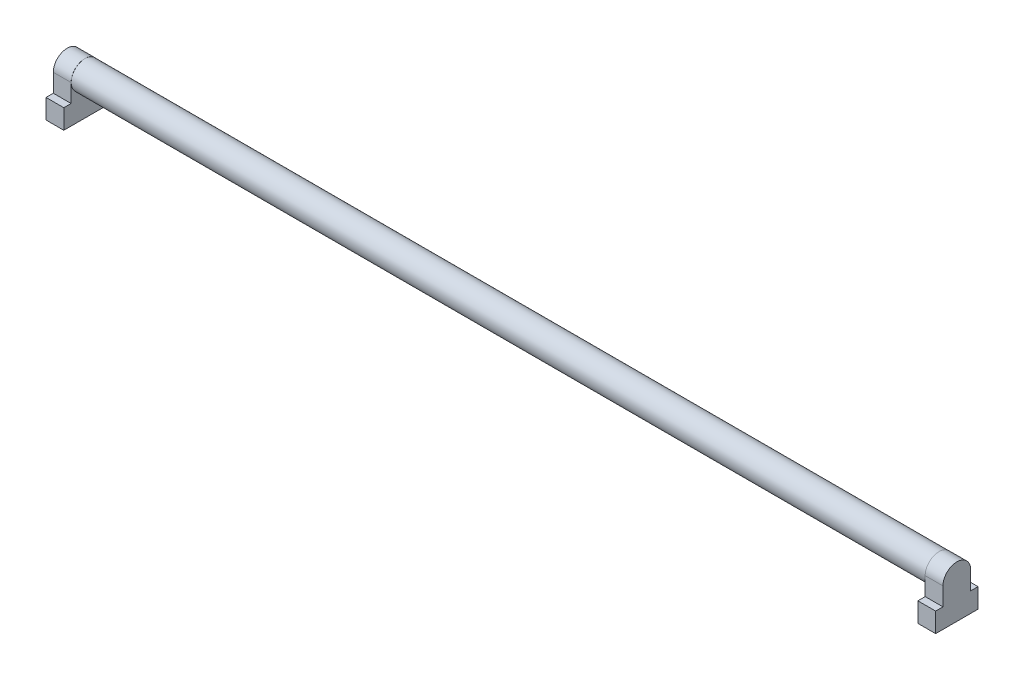
ISO-10303-21;
HEADER;
FILE_DESCRIPTION(('STEP AP214'),'2;1');
FILE_NAME('part.step','',(''),(''),'','','');
FILE_SCHEMA(('AUTOMOTIVE_DESIGN { 1 0 10303 214 1 1 1 1 }'));
ENDSEC;
DATA;
#1=APPLICATION_CONTEXT('core data for automotive mechanical design processes');
#2=APPLICATION_PROTOCOL_DEFINITION('international standard','automotive_design',2000,#1);
#3=PRODUCT_CONTEXT('',#1,'mechanical');
#4=PRODUCT('Part','Part','',(#3));
#5=PRODUCT_RELATED_PRODUCT_CATEGORY('part','',(#4));
#6=PRODUCT_DEFINITION_FORMATION('','',#4);
#7=PRODUCT_DEFINITION_CONTEXT('part definition',#1,'design');
#8=PRODUCT_DEFINITION('design','',#6,#7);
#9=PRODUCT_DEFINITION_SHAPE('','',#8);
#10=(LENGTH_UNIT() NAMED_UNIT(*) SI_UNIT(.MILLI.,.METRE.));
#11=(NAMED_UNIT(*) PLANE_ANGLE_UNIT() SI_UNIT($,.RADIAN.));
#12=(NAMED_UNIT(*) SI_UNIT($,.STERADIAN.) SOLID_ANGLE_UNIT());
#13=UNCERTAINTY_MEASURE_WITH_UNIT(LENGTH_MEASURE(1.E-05),#10,'distance_accuracy_value','');
#14=(GEOMETRIC_REPRESENTATION_CONTEXT(3) GLOBAL_UNCERTAINTY_ASSIGNED_CONTEXT((#13)) GLOBAL_UNIT_ASSIGNED_CONTEXT((#10,
#11,#12)) REPRESENTATION_CONTEXT('',''));
#15=CARTESIAN_POINT('',(0.,0.,0.));
#16=DIRECTION('',(0.,0.,1.));
#17=DIRECTION('',(1.,0.,0.));
#18=AXIS2_PLACEMENT_3D('',#15,#16,#17);
#19=CARTESIAN_POINT('',(240.,0.,0.));
#20=DIRECTION('',(-1.,0.,0.));
#21=DIRECTION('',(0.,0.,1.));
#22=AXIS2_PLACEMENT_3D('',#19,#20,#21);
#23=CYLINDRICAL_SURFACE('',#22,7.75);
#24=CARTESIAN_POINT('',(240.,0.,0.));
#25=DIRECTION('',(1.,0.,0.));
#26=DIRECTION('',(0.,0.,-1.));
#27=AXIS2_PLACEMENT_3D('',#24,#25,#26);
#28=CIRCLE('',#27,7.75);
#29=CARTESIAN_POINT('',(240.,0.,-7.75));
#30=VERTEX_POINT('',#29);
#31=EDGE_CURVE('E11',#30,#30,#28,.T.);
#32=ORIENTED_EDGE('',*,*,#31,.F.);
#33=EDGE_LOOP('',(#32));
#34=FACE_BOUND('',#33,.T.);
#35=CARTESIAN_POINT('',(-240.,0.,0.));
#36=DIRECTION('',(1.,0.,0.));
#37=DIRECTION('',(0.,0.,-1.));
#38=AXIS2_PLACEMENT_3D('',#35,#36,#37);
#39=CIRCLE('',#38,7.75);
#40=CARTESIAN_POINT('',(-240.,0.,-7.75));
#41=VERTEX_POINT('',#40);
#42=EDGE_CURVE('E140',#41,#41,#39,.T.);
#43=ORIENTED_EDGE('',*,*,#42,.T.);
#44=EDGE_LOOP('',(#43));
#45=FACE_BOUND('',#44,.T.);
#46=ADVANCED_FACE('F35',(#34,#45),#23,.T.);
#47=CARTESIAN_POINT('',(250.,0.,0.));
#48=DIRECTION('',(-1.,0.,0.));
#49=DIRECTION('',(0.,0.,1.));
#50=AXIS2_PLACEMENT_3D('',#47,#48,#49);
#51=CYLINDRICAL_SURFACE('',#50,7.8);
#52=CARTESIAN_POINT('',(240.,0.,0.));
#53=DIRECTION('',(1.,0.,0.));
#54=DIRECTION('',(0.,0.,1.));
#55=AXIS2_PLACEMENT_3D('',#52,#53,#54);
#56=CIRCLE('',#55,7.8);
#57=CARTESIAN_POINT('',(240.,0.,-7.8));
#58=VERTEX_POINT('',#57);
#59=CARTESIAN_POINT('',(240.,0.,7.8));
#60=VERTEX_POINT('',#59);
#61=EDGE_CURVE('E136',#58,#60,#56,.T.);
#62=ORIENTED_EDGE('',*,*,#61,.T.);
#63=DIRECTION('',(-1.,0.,0.));
#64=VECTOR('',#63,1.);
#65=CARTESIAN_POINT('',(250.,0.,7.8));
#66=LINE('',#65,#64);
#67=CARTESIAN_POINT('',(250.,0.,7.8));
#68=VERTEX_POINT('',#67);
#69=EDGE_CURVE('E43',#68,#60,#66,.T.);
#70=ORIENTED_EDGE('',*,*,#69,.F.);
#71=CARTESIAN_POINT('',(250.,0.,0.));
#72=DIRECTION('',(1.,0.,0.));
#73=DIRECTION('',(0.,0.,1.));
#74=AXIS2_PLACEMENT_3D('',#71,#72,#73);
#75=CIRCLE('',#74,7.8);
#76=CARTESIAN_POINT('',(250.,0.,-7.8));
#77=VERTEX_POINT('',#76);
#78=EDGE_CURVE('E151',#77,#68,#75,.T.);
#79=ORIENTED_EDGE('',*,*,#78,.F.);
#80=DIRECTION('',(-1.,0.,0.));
#81=VECTOR('',#80,1.);
#82=CARTESIAN_POINT('',(250.,0.,-7.8));
#83=LINE('',#82,#81);
#84=EDGE_CURVE('E132',#77,#58,#83,.T.);
#85=ORIENTED_EDGE('',*,*,#84,.T.);
#86=EDGE_LOOP('',(#62,#70,#79,#85));
#87=FACE_BOUND('',#86,.T.);
#88=ADVANCED_FACE('F168',(#87),#51,.T.);
#89=CARTESIAN_POINT('',(250.,0.,7.8));
#90=DIRECTION('',(0.,0.,-1.));
#91=DIRECTION('',(0.,1.,0.));
#92=AXIS2_PLACEMENT_3D('',#89,#90,#91);
#93=PLANE('',#92);
#94=DIRECTION('',(0.,-1.,0.));
#95=VECTOR('',#94,1.);
#96=CARTESIAN_POINT('',(240.,0.,7.8));
#97=LINE('',#96,#95);
#98=CARTESIAN_POINT('',(240.,-10.2,7.8));
#99=VERTEX_POINT('',#98);
#100=EDGE_CURVE('E139',#60,#99,#97,.T.);
#101=ORIENTED_EDGE('',*,*,#100,.T.);
#102=DIRECTION('',(-1.,0.,0.));
#103=VECTOR('',#102,1.);
#104=CARTESIAN_POINT('',(250.,-10.2,7.8));
#105=LINE('',#104,#103);
#106=CARTESIAN_POINT('',(250.,-10.2,7.8));
#107=VERTEX_POINT('',#106);
#108=EDGE_CURVE('E161',#107,#99,#105,.T.);
#109=ORIENTED_EDGE('',*,*,#108,.F.);
#110=DIRECTION('',(0.,-1.,0.));
#111=VECTOR('',#110,1.);
#112=CARTESIAN_POINT('',(250.,0.,7.8));
#113=LINE('',#112,#111);
#114=EDGE_CURVE('E96',#68,#107,#113,.T.);
#115=ORIENTED_EDGE('',*,*,#114,.F.);
#116=ORIENTED_EDGE('',*,*,#69,.T.);
#117=EDGE_LOOP('',(#101,#109,#115,#116));
#118=FACE_BOUND('',#117,.T.);
#119=ADVANCED_FACE('F164',(#118),#93,.F.);
#120=CARTESIAN_POINT('',(250.,-10.2,7.8));
#121=DIRECTION('',(0.,-1.,0.));
#122=DIRECTION('',(0.,0.,-1.));
#123=AXIS2_PLACEMENT_3D('',#120,#121,#122);
#124=PLANE('',#123);
#125=DIRECTION('',(0.,0.,1.));
#126=VECTOR('',#125,1.);
#127=CARTESIAN_POINT('',(240.,-10.2,7.8));
#128=LINE('',#127,#126);
#129=CARTESIAN_POINT('',(240.,-10.2,11.9));
#130=VERTEX_POINT('',#129);
#131=EDGE_CURVE('E142',#99,#130,#128,.T.);
#132=ORIENTED_EDGE('',*,*,#131,.T.);
#133=DIRECTION('',(-1.,0.,0.));
#134=VECTOR('',#133,1.);
#135=CARTESIAN_POINT('',(250.,-10.2,11.9));
#136=LINE('',#135,#134);
#137=CARTESIAN_POINT('',(250.,-10.2,11.9));
#138=VERTEX_POINT('',#137);
#139=EDGE_CURVE('E158',#138,#130,#136,.T.);
#140=ORIENTED_EDGE('',*,*,#139,.F.);
#141=DIRECTION('',(0.,0.,1.));
#142=VECTOR('',#141,1.);
#143=CARTESIAN_POINT('',(250.,-10.2,7.8));
#144=LINE('',#143,#142);
#145=EDGE_CURVE('E183',#107,#138,#144,.T.);
#146=ORIENTED_EDGE('',*,*,#145,.F.);
#147=ORIENTED_EDGE('',*,*,#108,.T.);
#148=EDGE_LOOP('',(#132,#140,#146,#147));
#149=FACE_BOUND('',#148,.T.);
#150=ADVANCED_FACE('F176',(#149),#124,.F.);
#151=CARTESIAN_POINT('',(250.,-10.2,11.9));
#152=DIRECTION('',(0.,0.,-1.));
#153=DIRECTION('',(0.,1.,0.));
#154=AXIS2_PLACEMENT_3D('',#151,#152,#153);
#155=PLANE('',#154);
#156=DIRECTION('',(0.,-1.,0.));
#157=VECTOR('',#156,1.);
#158=CARTESIAN_POINT('',(240.,-10.2,11.9));
#159=LINE('',#158,#157);
#160=CARTESIAN_POINT('',(240.,-21.2,11.9));
#161=VERTEX_POINT('',#160);
#162=EDGE_CURVE('E144',#130,#161,#159,.T.);
#163=ORIENTED_EDGE('',*,*,#162,.T.);
#164=DIRECTION('',(-1.,0.,0.));
#165=VECTOR('',#164,1.);
#166=CARTESIAN_POINT('',(250.,-21.2,11.9));
#167=LINE('',#166,#165);
#168=CARTESIAN_POINT('',(250.,-21.2,11.9));
#169=VERTEX_POINT('',#168);
#170=EDGE_CURVE('E155',#169,#161,#167,.T.);
#171=ORIENTED_EDGE('',*,*,#170,.F.);
#172=DIRECTION('',(0.,-1.,0.));
#173=VECTOR('',#172,1.);
#174=CARTESIAN_POINT('',(250.,-10.2,11.9));
#175=LINE('',#174,#173);
#176=EDGE_CURVE('E182',#138,#169,#175,.T.);
#177=ORIENTED_EDGE('',*,*,#176,.F.);
#178=ORIENTED_EDGE('',*,*,#139,.T.);
#179=EDGE_LOOP('',(#163,#171,#177,#178));
#180=FACE_BOUND('',#179,.T.);
#181=ADVANCED_FACE('F180',(#180),#155,.F.);
#182=CARTESIAN_POINT('',(250.,-21.2,11.9));
#183=DIRECTION('',(0.,1.,0.));
#184=DIRECTION('',(0.,0.,1.));
#185=AXIS2_PLACEMENT_3D('',#182,#183,#184);
#186=PLANE('',#185);
#187=DIRECTION('',(0.,0.,-1.));
#188=VECTOR('',#187,1.);
#189=CARTESIAN_POINT('',(240.,-21.2,11.9));
#190=LINE('',#189,#188);
#191=CARTESIAN_POINT('',(240.,-21.2,-11.9));
#192=VERTEX_POINT('',#191);
#193=EDGE_CURVE('E146',#161,#192,#190,.T.);
#194=ORIENTED_EDGE('',*,*,#193,.T.);
#195=DIRECTION('',(-1.,0.,0.));
#196=VECTOR('',#195,1.);
#197=CARTESIAN_POINT('',(250.,-21.2,-11.9));
#198=LINE('',#197,#196);
#199=CARTESIAN_POINT('',(250.,-21.2,-11.9));
#200=VERTEX_POINT('',#199);
#201=EDGE_CURVE('E127',#200,#192,#198,.T.);
#202=ORIENTED_EDGE('',*,*,#201,.F.);
#203=DIRECTION('',(0.,0.,-1.));
#204=VECTOR('',#203,1.);
#205=CARTESIAN_POINT('',(250.,-21.2,11.9));
#206=LINE('',#205,#204);
#207=EDGE_CURVE('E118',#169,#200,#206,.T.);
#208=ORIENTED_EDGE('',*,*,#207,.F.);
#209=ORIENTED_EDGE('',*,*,#170,.T.);
#210=EDGE_LOOP('',(#194,#202,#208,#209));
#211=FACE_BOUND('',#210,.T.);
#212=ADVANCED_FACE('F465',(#211),#186,.F.);
#213=CARTESIAN_POINT('',(250.,-21.2,-11.9));
#214=DIRECTION('',(0.,0.,1.));
#215=DIRECTION('',(1.,0.,0.));
#216=AXIS2_PLACEMENT_3D('',#213,#214,#215);
#217=PLANE('',#216);
#218=DIRECTION('',(0.,1.,0.));
#219=VECTOR('',#218,1.);
#220=CARTESIAN_POINT('',(240.,-21.2,-11.9));
#221=LINE('',#220,#219);
#222=CARTESIAN_POINT('',(240.,-10.2,-11.9));
#223=VERTEX_POINT('',#222);
#224=EDGE_CURVE('E126',#192,#223,#221,.T.);
#225=ORIENTED_EDGE('',*,*,#224,.T.);
#226=DIRECTION('',(-1.,0.,0.));
#227=VECTOR('',#226,1.);
#228=CARTESIAN_POINT('',(250.,-10.2,-11.9));
#229=LINE('',#228,#227);
#230=CARTESIAN_POINT('',(250.,-10.2,-11.9));
#231=VERTEX_POINT('',#230);
#232=EDGE_CURVE('E123',#231,#223,#229,.T.);
#233=ORIENTED_EDGE('',*,*,#232,.F.);
#234=DIRECTION('',(0.,1.,0.));
#235=VECTOR('',#234,1.);
#236=CARTESIAN_POINT('',(250.,-21.2,-11.9));
#237=LINE('',#236,#235);
#238=EDGE_CURVE('E112',#200,#231,#237,.T.);
#239=ORIENTED_EDGE('',*,*,#238,.F.);
#240=ORIENTED_EDGE('',*,*,#201,.T.);
#241=EDGE_LOOP('',(#225,#233,#239,#240));
#242=FACE_BOUND('',#241,.T.);
#243=ADVANCED_FACE('F124',(#242),#217,.F.);
#244=CARTESIAN_POINT('',(250.,-10.2,-11.9));
#245=DIRECTION('',(0.,-1.,0.));
#246=DIRECTION('',(0.,0.,-1.));
#247=AXIS2_PLACEMENT_3D('',#244,#245,#246);
#248=PLANE('',#247);
#249=DIRECTION('',(0.,0.,1.));
#250=VECTOR('',#249,1.);
#251=CARTESIAN_POINT('',(240.,-10.2,-11.9));
#252=LINE('',#251,#250);
#253=CARTESIAN_POINT('',(240.,-10.2,-7.8));
#254=VERTEX_POINT('',#253);
#255=EDGE_CURVE('E81',#223,#254,#252,.T.);
#256=ORIENTED_EDGE('',*,*,#255,.T.);
#257=DIRECTION('',(-1.,0.,0.));
#258=VECTOR('',#257,1.);
#259=CARTESIAN_POINT('',(250.,-10.2,-7.8));
#260=LINE('',#259,#258);
#261=CARTESIAN_POINT('',(250.,-10.2,-7.8));
#262=VERTEX_POINT('',#261);
#263=EDGE_CURVE('E128',#262,#254,#260,.T.);
#264=ORIENTED_EDGE('',*,*,#263,.F.);
#265=DIRECTION('',(0.,0.,1.));
#266=VECTOR('',#265,1.);
#267=CARTESIAN_POINT('',(250.,-10.2,-11.9));
#268=LINE('',#267,#266);
#269=EDGE_CURVE('E116',#231,#262,#268,.T.);
#270=ORIENTED_EDGE('',*,*,#269,.F.);
#271=ORIENTED_EDGE('',*,*,#232,.T.);
#272=EDGE_LOOP('',(#256,#264,#270,#271));
#273=FACE_BOUND('',#272,.T.);
#274=ADVANCED_FACE('F130',(#273),#248,.F.);
#275=CARTESIAN_POINT('',(250.,-10.2,-7.8));
#276=DIRECTION('',(0.,0.,1.));
#277=DIRECTION('',(0.,-1.,0.));
#278=AXIS2_PLACEMENT_3D('',#275,#276,#277);
#279=PLANE('',#278);
#280=DIRECTION('',(0.,1.,0.));
#281=VECTOR('',#280,1.);
#282=CARTESIAN_POINT('',(240.,-10.2,-7.8));
#283=LINE('',#282,#281);
#284=EDGE_CURVE('E87',#254,#58,#283,.T.);
#285=ORIENTED_EDGE('',*,*,#284,.T.);
#286=ORIENTED_EDGE('',*,*,#84,.F.);
#287=DIRECTION('',(0.,1.,0.));
#288=VECTOR('',#287,1.);
#289=CARTESIAN_POINT('',(250.,-10.2,-7.8));
#290=LINE('',#289,#288);
#291=EDGE_CURVE('E51',#262,#77,#290,.T.);
#292=ORIENTED_EDGE('',*,*,#291,.F.);
#293=ORIENTED_EDGE('',*,*,#263,.T.);
#294=EDGE_LOOP('',(#285,#286,#292,#293));
#295=FACE_BOUND('',#294,.T.);
#296=ADVANCED_FACE('F443',(#295),#279,.F.);
#297=CARTESIAN_POINT('',(250.,0.,0.));
#298=DIRECTION('',(-1.,0.,0.));
#299=DIRECTION('',(0.,0.,1.));
#300=AXIS2_PLACEMENT_3D('',#297,#298,#299);
#301=PLANE('',#300);
#302=ORIENTED_EDGE('',*,*,#78,.T.);
#303=ORIENTED_EDGE('',*,*,#114,.T.);
#304=ORIENTED_EDGE('',*,*,#145,.T.);
#305=ORIENTED_EDGE('',*,*,#176,.T.);
#306=ORIENTED_EDGE('',*,*,#207,.T.);
#307=ORIENTED_EDGE('',*,*,#238,.T.);
#308=ORIENTED_EDGE('',*,*,#269,.T.);
#309=ORIENTED_EDGE('',*,*,#291,.T.);
#310=EDGE_LOOP('',(#302,#303,#304,#305,#306,#307,#308,#309));
#311=FACE_BOUND('',#310,.T.);
#312=ADVANCED_FACE('F114',(#311),#301,.F.);
#313=CARTESIAN_POINT('',(240.,0.,0.));
#314=DIRECTION('',(-1.,0.,0.));
#315=DIRECTION('',(0.,0.,1.));
#316=AXIS2_PLACEMENT_3D('',#313,#314,#315);
#317=PLANE('',#316);
#318=ORIENTED_EDGE('',*,*,#31,.T.);
#319=EDGE_LOOP('',(#318));
#320=FACE_BOUND('',#319,.T.);
#321=ORIENTED_EDGE('',*,*,#61,.F.);
#322=ORIENTED_EDGE('',*,*,#284,.F.);
#323=ORIENTED_EDGE('',*,*,#255,.F.);
#324=ORIENTED_EDGE('',*,*,#224,.F.);
#325=ORIENTED_EDGE('',*,*,#193,.F.);
#326=ORIENTED_EDGE('',*,*,#162,.F.);
#327=ORIENTED_EDGE('',*,*,#131,.F.);
#328=ORIENTED_EDGE('',*,*,#100,.F.);
#329=EDGE_LOOP('',(#321,#322,#323,#324,#325,#326,#327,#328));
#330=FACE_BOUND('',#329,.T.);
#331=ADVANCED_FACE('F170',(#320,#330),#317,.T.);
#332=CARTESIAN_POINT('',(-250.,0.,0.));
#333=DIRECTION('',(1.,0.,0.));
#334=DIRECTION('',(0.,0.,-1.));
#335=AXIS2_PLACEMENT_3D('',#332,#333,#334);
#336=CYLINDRICAL_SURFACE('',#335,7.8);
#337=CARTESIAN_POINT('',(-240.,0.,0.));
#338=DIRECTION('',(1.,0.,0.));
#339=DIRECTION('',(0.,0.,1.));
#340=AXIS2_PLACEMENT_3D('',#337,#338,#339);
#341=CIRCLE('',#340,7.8);
#342=CARTESIAN_POINT('',(-240.,0.,-7.8));
#343=VERTEX_POINT('',#342);
#344=CARTESIAN_POINT('',(-240.,0.,7.8));
#345=VERTEX_POINT('',#344);
#346=EDGE_CURVE('E238',#343,#345,#341,.T.);
#347=ORIENTED_EDGE('',*,*,#346,.F.);
#348=DIRECTION('',(1.,0.,0.));
#349=VECTOR('',#348,1.);
#350=CARTESIAN_POINT('',(-250.,0.,-7.8));
#351=LINE('',#350,#349);
#352=CARTESIAN_POINT('',(-250.,0.,-7.8));
#353=VERTEX_POINT('',#352);
#354=EDGE_CURVE('E191',#353,#343,#351,.T.);
#355=ORIENTED_EDGE('',*,*,#354,.F.);
#356=CARTESIAN_POINT('',(-250.,0.,0.));
#357=DIRECTION('',(1.,0.,0.));
#358=DIRECTION('',(0.,0.,1.));
#359=AXIS2_PLACEMENT_3D('',#356,#357,#358);
#360=CIRCLE('',#359,7.8);
#361=CARTESIAN_POINT('',(-250.,0.,7.8));
#362=VERTEX_POINT('',#361);
#363=EDGE_CURVE('E219',#353,#362,#360,.T.);
#364=ORIENTED_EDGE('',*,*,#363,.T.);
#365=DIRECTION('',(1.,0.,0.));
#366=VECTOR('',#365,1.);
#367=CARTESIAN_POINT('',(-250.,0.,7.8));
#368=LINE('',#367,#366);
#369=EDGE_CURVE('E212',#362,#345,#368,.T.);
#370=ORIENTED_EDGE('',*,*,#369,.T.);
#371=EDGE_LOOP('',(#347,#355,#364,#370));
#372=FACE_BOUND('',#371,.T.);
#373=ADVANCED_FACE('F267',(#372),#336,.T.);
#374=CARTESIAN_POINT('',(-250.,-10.2,-7.8));
#375=DIRECTION('',(0.,0.,-1.));
#376=DIRECTION('',(0.,1.,0.));
#377=AXIS2_PLACEMENT_3D('',#374,#375,#376);
#378=PLANE('',#377);
#379=DIRECTION('',(0.,1.,0.));
#380=VECTOR('',#379,1.);
#381=CARTESIAN_POINT('',(-240.,-10.2,-7.8));
#382=LINE('',#381,#380);
#383=CARTESIAN_POINT('',(-240.,-10.2,-7.8));
#384=VERTEX_POINT('',#383);
#385=EDGE_CURVE('E235',#384,#343,#382,.T.);
#386=ORIENTED_EDGE('',*,*,#385,.F.);
#387=DIRECTION('',(1.,0.,0.));
#388=VECTOR('',#387,1.);
#389=CARTESIAN_POINT('',(-250.,-10.2,-7.8));
#390=LINE('',#389,#388);
#391=CARTESIAN_POINT('',(-250.,-10.2,-7.8));
#392=VERTEX_POINT('',#391);
#393=EDGE_CURVE('E194',#392,#384,#390,.T.);
#394=ORIENTED_EDGE('',*,*,#393,.F.);
#395=DIRECTION('',(0.,1.,0.));
#396=VECTOR('',#395,1.);
#397=CARTESIAN_POINT('',(-250.,-10.2,-7.8));
#398=LINE('',#397,#396);
#399=EDGE_CURVE('E258',#392,#353,#398,.T.);
#400=ORIENTED_EDGE('',*,*,#399,.T.);
#401=ORIENTED_EDGE('',*,*,#354,.T.);
#402=EDGE_LOOP('',(#386,#394,#400,#401));
#403=FACE_BOUND('',#402,.T.);
#404=ADVANCED_FACE('F328',(#403),#378,.T.);
#405=CARTESIAN_POINT('',(-250.,-10.2,-11.9));
#406=DIRECTION('',(0.,1.,0.));
#407=DIRECTION('',(0.,0.,1.));
#408=AXIS2_PLACEMENT_3D('',#405,#406,#407);
#409=PLANE('',#408);
#410=DIRECTION('',(0.,0.,1.));
#411=VECTOR('',#410,1.);
#412=CARTESIAN_POINT('',(-240.,-10.2,-11.9));
#413=LINE('',#412,#411);
#414=CARTESIAN_POINT('',(-240.,-10.2,-11.9));
#415=VERTEX_POINT('',#414);
#416=EDGE_CURVE('E232',#415,#384,#413,.T.);
#417=ORIENTED_EDGE('',*,*,#416,.F.);
#418=DIRECTION('',(1.,0.,0.));
#419=VECTOR('',#418,1.);
#420=CARTESIAN_POINT('',(-250.,-10.2,-11.9));
#421=LINE('',#420,#419);
#422=CARTESIAN_POINT('',(-250.,-10.2,-11.9));
#423=VERTEX_POINT('',#422);
#424=EDGE_CURVE('E197',#423,#415,#421,.T.);
#425=ORIENTED_EDGE('',*,*,#424,.F.);
#426=DIRECTION('',(0.,0.,1.));
#427=VECTOR('',#426,1.);
#428=CARTESIAN_POINT('',(-250.,-10.2,-11.9));
#429=LINE('',#428,#427);
#430=EDGE_CURVE('E255',#423,#392,#429,.T.);
#431=ORIENTED_EDGE('',*,*,#430,.T.);
#432=ORIENTED_EDGE('',*,*,#393,.T.);
#433=EDGE_LOOP('',(#417,#425,#431,#432));
#434=FACE_BOUND('',#433,.T.);
#435=ADVANCED_FACE('F330',(#434),#409,.T.);
#436=CARTESIAN_POINT('',(-250.,-21.2,-11.9));
#437=DIRECTION('',(0.,0.,-1.));
#438=DIRECTION('',(-1.,0.,0.));
#439=AXIS2_PLACEMENT_3D('',#436,#437,#438);
#440=PLANE('',#439);
#441=DIRECTION('',(0.,1.,0.));
#442=VECTOR('',#441,1.);
#443=CARTESIAN_POINT('',(-240.,-21.2,-11.9));
#444=LINE('',#443,#442);
#445=CARTESIAN_POINT('',(-240.,-21.2,-11.9));
#446=VERTEX_POINT('',#445);
#447=EDGE_CURVE('E229',#446,#415,#444,.T.);
#448=ORIENTED_EDGE('',*,*,#447,.F.);
#449=DIRECTION('',(1.,0.,0.));
#450=VECTOR('',#449,1.);
#451=CARTESIAN_POINT('',(-250.,-21.2,-11.9));
#452=LINE('',#451,#450);
#453=CARTESIAN_POINT('',(-250.,-21.2,-11.9));
#454=VERTEX_POINT('',#453);
#455=EDGE_CURVE('E200',#454,#446,#452,.T.);
#456=ORIENTED_EDGE('',*,*,#455,.F.);
#457=DIRECTION('',(0.,1.,0.));
#458=VECTOR('',#457,1.);
#459=CARTESIAN_POINT('',(-250.,-21.2,-11.9));
#460=LINE('',#459,#458);
#461=EDGE_CURVE('E252',#454,#423,#460,.T.);
#462=ORIENTED_EDGE('',*,*,#461,.T.);
#463=ORIENTED_EDGE('',*,*,#424,.T.);
#464=EDGE_LOOP('',(#448,#456,#462,#463));
#465=FACE_BOUND('',#464,.T.);
#466=ADVANCED_FACE('F333',(#465),#440,.T.);
#467=CARTESIAN_POINT('',(-250.,-21.2,11.9));
#468=DIRECTION('',(0.,-1.,0.));
#469=DIRECTION('',(0.,0.,-1.));
#470=AXIS2_PLACEMENT_3D('',#467,#468,#469);
#471=PLANE('',#470);
#472=DIRECTION('',(0.,0.,-1.));
#473=VECTOR('',#472,1.);
#474=CARTESIAN_POINT('',(-240.,-21.2,11.9));
#475=LINE('',#474,#473);
#476=CARTESIAN_POINT('',(-240.,-21.2,11.9));
#477=VERTEX_POINT('',#476);
#478=EDGE_CURVE('E226',#477,#446,#475,.T.);
#479=ORIENTED_EDGE('',*,*,#478,.F.);
#480=DIRECTION('',(1.,0.,0.));
#481=VECTOR('',#480,1.);
#482=CARTESIAN_POINT('',(-250.,-21.2,11.9));
#483=LINE('',#482,#481);
#484=CARTESIAN_POINT('',(-250.,-21.2,11.9));
#485=VERTEX_POINT('',#484);
#486=EDGE_CURVE('E203',#485,#477,#483,.T.);
#487=ORIENTED_EDGE('',*,*,#486,.F.);
#488=DIRECTION('',(0.,0.,-1.));
#489=VECTOR('',#488,1.);
#490=CARTESIAN_POINT('',(-250.,-21.2,11.9));
#491=LINE('',#490,#489);
#492=EDGE_CURVE('E249',#485,#454,#491,.T.);
#493=ORIENTED_EDGE('',*,*,#492,.T.);
#494=ORIENTED_EDGE('',*,*,#455,.T.);
#495=EDGE_LOOP('',(#479,#487,#493,#494));
#496=FACE_BOUND('',#495,.T.);
#497=ADVANCED_FACE('F316',(#496),#471,.T.);
#498=CARTESIAN_POINT('',(-250.,-10.2,11.9));
#499=DIRECTION('',(0.,0.,1.));
#500=DIRECTION('',(0.,-1.,0.));
#501=AXIS2_PLACEMENT_3D('',#498,#499,#500);
#502=PLANE('',#501);
#503=DIRECTION('',(0.,-1.,0.));
#504=VECTOR('',#503,1.);
#505=CARTESIAN_POINT('',(-240.,-10.2,11.9));
#506=LINE('',#505,#504);
#507=CARTESIAN_POINT('',(-240.,-10.2,11.9));
#508=VERTEX_POINT('',#507);
#509=EDGE_CURVE('E223',#508,#477,#506,.T.);
#510=ORIENTED_EDGE('',*,*,#509,.F.);
#511=DIRECTION('',(1.,0.,0.));
#512=VECTOR('',#511,1.);
#513=CARTESIAN_POINT('',(-250.,-10.2,11.9));
#514=LINE('',#513,#512);
#515=CARTESIAN_POINT('',(-250.,-10.2,11.9));
#516=VERTEX_POINT('',#515);
#517=EDGE_CURVE('E206',#516,#508,#514,.T.);
#518=ORIENTED_EDGE('',*,*,#517,.F.);
#519=DIRECTION('',(0.,-1.,0.));
#520=VECTOR('',#519,1.);
#521=CARTESIAN_POINT('',(-250.,-10.2,11.9));
#522=LINE('',#521,#520);
#523=EDGE_CURVE('E246',#516,#485,#522,.T.);
#524=ORIENTED_EDGE('',*,*,#523,.T.);
#525=ORIENTED_EDGE('',*,*,#486,.T.);
#526=EDGE_LOOP('',(#510,#518,#524,#525));
#527=FACE_BOUND('',#526,.T.);
#528=ADVANCED_FACE('F321',(#527),#502,.T.);
#529=CARTESIAN_POINT('',(-250.,-10.2,7.8));
#530=DIRECTION('',(0.,1.,0.));
#531=DIRECTION('',(0.,0.,1.));
#532=AXIS2_PLACEMENT_3D('',#529,#530,#531);
#533=PLANE('',#532);
#534=DIRECTION('',(0.,0.,1.));
#535=VECTOR('',#534,1.);
#536=CARTESIAN_POINT('',(-240.,-10.2,7.8));
#537=LINE('',#536,#535);
#538=CARTESIAN_POINT('',(-240.,-10.2,7.8));
#539=VERTEX_POINT('',#538);
#540=EDGE_CURVE('E220',#539,#508,#537,.T.);
#541=ORIENTED_EDGE('',*,*,#540,.F.);
#542=DIRECTION('',(1.,0.,0.));
#543=VECTOR('',#542,1.);
#544=CARTESIAN_POINT('',(-250.,-10.2,7.8));
#545=LINE('',#544,#543);
#546=CARTESIAN_POINT('',(-250.,-10.2,7.8));
#547=VERTEX_POINT('',#546);
#548=EDGE_CURVE('E209',#547,#539,#545,.T.);
#549=ORIENTED_EDGE('',*,*,#548,.F.);
#550=DIRECTION('',(0.,0.,1.));
#551=VECTOR('',#550,1.);
#552=CARTESIAN_POINT('',(-250.,-10.2,7.8));
#553=LINE('',#552,#551);
#554=EDGE_CURVE('E243',#547,#516,#553,.T.);
#555=ORIENTED_EDGE('',*,*,#554,.T.);
#556=ORIENTED_EDGE('',*,*,#517,.T.);
#557=EDGE_LOOP('',(#541,#549,#555,#556));
#558=FACE_BOUND('',#557,.T.);
#559=ADVANCED_FACE('F322',(#558),#533,.T.);
#560=CARTESIAN_POINT('',(-250.,0.,7.8));
#561=DIRECTION('',(0.,0.,1.));
#562=DIRECTION('',(0.,-1.,0.));
#563=AXIS2_PLACEMENT_3D('',#560,#561,#562);
#564=PLANE('',#563);
#565=DIRECTION('',(0.,-1.,0.));
#566=VECTOR('',#565,1.);
#567=CARTESIAN_POINT('',(-240.,0.,7.8));
#568=LINE('',#567,#566);
#569=EDGE_CURVE('E216',#345,#539,#568,.T.);
#570=ORIENTED_EDGE('',*,*,#569,.F.);
#571=ORIENTED_EDGE('',*,*,#369,.F.);
#572=DIRECTION('',(0.,-1.,0.));
#573=VECTOR('',#572,1.);
#574=CARTESIAN_POINT('',(-250.,0.,7.8));
#575=LINE('',#574,#573);
#576=EDGE_CURVE('E215',#362,#547,#575,.T.);
#577=ORIENTED_EDGE('',*,*,#576,.T.);
#578=ORIENTED_EDGE('',*,*,#548,.T.);
#579=EDGE_LOOP('',(#570,#571,#577,#578));
#580=FACE_BOUND('',#579,.T.);
#581=ADVANCED_FACE('F279',(#580),#564,.T.);
#582=CARTESIAN_POINT('',(-250.,0.,0.));
#583=DIRECTION('',(1.,0.,0.));
#584=DIRECTION('',(0.,0.,1.));
#585=AXIS2_PLACEMENT_3D('',#582,#583,#584);
#586=PLANE('',#585);
#587=ORIENTED_EDGE('',*,*,#363,.F.);
#588=ORIENTED_EDGE('',*,*,#399,.F.);
#589=ORIENTED_EDGE('',*,*,#430,.F.);
#590=ORIENTED_EDGE('',*,*,#461,.F.);
#591=ORIENTED_EDGE('',*,*,#492,.F.);
#592=ORIENTED_EDGE('',*,*,#523,.F.);
#593=ORIENTED_EDGE('',*,*,#554,.F.);
#594=ORIENTED_EDGE('',*,*,#576,.F.);
#595=EDGE_LOOP('',(#587,#588,#589,#590,#591,#592,#593,#594));
#596=FACE_BOUND('',#595,.T.);
#597=ADVANCED_FACE('F275',(#596),#586,.F.);
#598=CARTESIAN_POINT('',(-240.,0.,0.));
#599=DIRECTION('',(1.,0.,0.));
#600=DIRECTION('',(0.,0.,1.));
#601=AXIS2_PLACEMENT_3D('',#598,#599,#600);
#602=PLANE('',#601);
#603=ORIENTED_EDGE('',*,*,#42,.F.);
#604=EDGE_LOOP('',(#603));
#605=FACE_BOUND('',#604,.T.);
#606=ORIENTED_EDGE('',*,*,#346,.T.);
#607=ORIENTED_EDGE('',*,*,#569,.T.);
#608=ORIENTED_EDGE('',*,*,#540,.T.);
#609=ORIENTED_EDGE('',*,*,#509,.T.);
#610=ORIENTED_EDGE('',*,*,#478,.T.);
#611=ORIENTED_EDGE('',*,*,#447,.T.);
#612=ORIENTED_EDGE('',*,*,#416,.T.);
#613=ORIENTED_EDGE('',*,*,#385,.T.);
#614=EDGE_LOOP('',(#606,#607,#608,#609,#610,#611,#612,#613));
#615=FACE_BOUND('',#614,.T.);
#616=ADVANCED_FACE('F324',(#605,#615),#602,.T.);
#617=CLOSED_SHELL('',(#46,#88,#119,#150,#181,#212,#243,#274,#296,#312,#331,#373,#404,#435,#466,
#497,#528,#559,#581,#597,#616));
#618=MANIFOLD_SOLID_BREP('B2',#617);
#619=ADVANCED_BREP_SHAPE_REPRESENTATION('',(#18,#618),#14);
#620=SHAPE_DEFINITION_REPRESENTATION(#9,#619);
ENDSEC;
END-ISO-10303-21;
